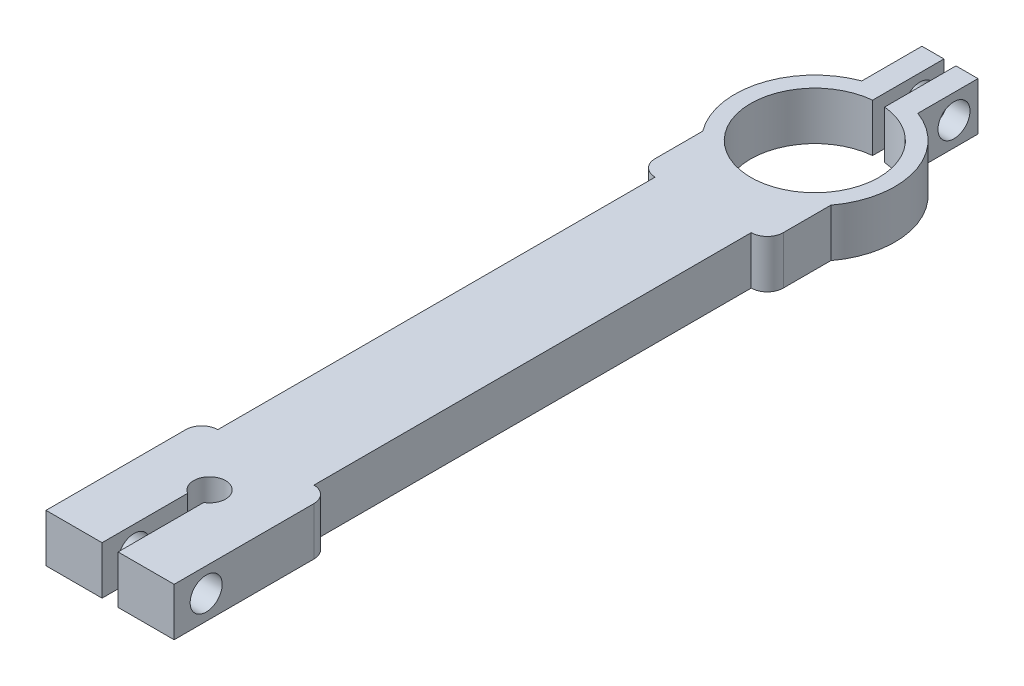
ISO-10303-21;
HEADER;
FILE_DESCRIPTION(('STEP AP214'),'2;1');
FILE_NAME('part.step','',(''),(''),'','','');
FILE_SCHEMA(('AUTOMOTIVE_DESIGN { 1 0 10303 214 1 1 1 1 }'));
ENDSEC;
DATA;
#1=APPLICATION_CONTEXT('core data for automotive mechanical design processes');
#2=APPLICATION_PROTOCOL_DEFINITION('international standard','automotive_design',2000,#1);
#3=PRODUCT_CONTEXT('',#1,'mechanical');
#4=PRODUCT('Part','Part','',(#3));
#5=PRODUCT_RELATED_PRODUCT_CATEGORY('part','',(#4));
#6=PRODUCT_DEFINITION_FORMATION('','',#4);
#7=PRODUCT_DEFINITION_CONTEXT('part definition',#1,'design');
#8=PRODUCT_DEFINITION('design','',#6,#7);
#9=PRODUCT_DEFINITION_SHAPE('','',#8);
#10=(LENGTH_UNIT() NAMED_UNIT(*) SI_UNIT(.MILLI.,.METRE.));
#11=(NAMED_UNIT(*) PLANE_ANGLE_UNIT() SI_UNIT($,.RADIAN.));
#12=(NAMED_UNIT(*) SI_UNIT($,.STERADIAN.) SOLID_ANGLE_UNIT());
#13=UNCERTAINTY_MEASURE_WITH_UNIT(LENGTH_MEASURE(1.E-05),#10,'distance_accuracy_value','');
#14=(GEOMETRIC_REPRESENTATION_CONTEXT(3) GLOBAL_UNCERTAINTY_ASSIGNED_CONTEXT((#13)) GLOBAL_UNIT_ASSIGNED_CONTEXT((#10,
#11,#12)) REPRESENTATION_CONTEXT('',''));
#15=CARTESIAN_POINT('',(0.,0.,0.));
#16=DIRECTION('',(0.,0.,1.));
#17=DIRECTION('',(1.,0.,0.));
#18=AXIS2_PLACEMENT_3D('',#15,#16,#17);
#19=CARTESIAN_POINT('',(0.,3.,0.));
#20=DIRECTION('',(0.,-1.,0.));
#21=DIRECTION('',(0.,0.,-1.));
#22=AXIS2_PLACEMENT_3D('',#19,#20,#21);
#23=PLANE('',#22);
#24=DIRECTION('',(0.,0.,1.));
#25=VECTOR('',#24,1.);
#26=CARTESIAN_POINT('',(3.,3.,0.));
#27=LINE('',#26,#25);
#28=CARTESIAN_POINT('',(3.,3.,-37.0293999803373));
#29=VERTEX_POINT('',#28);
#30=CARTESIAN_POINT('',(3.,3.,-9.72603449388032));
#31=VERTEX_POINT('',#30);
#32=EDGE_CURVE('E229',#29,#31,#27,.T.);
#33=ORIENTED_EDGE('',*,*,#32,.F.);
#34=CARTESIAN_POINT('',(3.,3.,-38.0293999803373));
#35=DIRECTION('',(0.,-1.,0.));
#36=DIRECTION('',(0.,0.,-1.));
#37=AXIS2_PLACEMENT_3D('',#34,#35,#36);
#38=CIRCLE('',#37,1.);
#39=CARTESIAN_POINT('',(4.,3.,-38.0293999803373));
#40=VERTEX_POINT('',#39);
#41=EDGE_CURVE('E453',#29,#40,#38,.F.);
#42=ORIENTED_EDGE('',*,*,#41,.T.);
#43=DIRECTION('',(0.,0.,-1.));
#44=VECTOR('',#43,1.);
#45=CARTESIAN_POINT('',(4.,3.,0.));
#46=LINE('',#45,#44);
#47=CARTESIAN_POINT('',(4.,3.,-41.));
#48=VERTEX_POINT('',#47);
#49=EDGE_CURVE('E405',#40,#48,#46,.T.);
#50=ORIENTED_EDGE('',*,*,#49,.T.);
#51=CARTESIAN_POINT('',(0.,3.,-44.));
#52=DIRECTION('',(0.,1.,0.));
#53=DIRECTION('',(0.,0.,1.));
#54=AXIS2_PLACEMENT_3D('',#51,#52,#53);
#55=CIRCLE('',#54,5.);
#56=CARTESIAN_POINT('',(1.75,3.,-48.6837484987988));
#57=VERTEX_POINT('',#56);
#58=EDGE_CURVE('E387',#48,#57,#55,.T.);
#59=ORIENTED_EDGE('',*,*,#58,.T.);
#60=DIRECTION('',(0.,0.,1.));
#61=VECTOR('',#60,1.);
#62=CARTESIAN_POINT('',(1.75,3.,-52.4372870221925));
#63=LINE('',#62,#61);
#64=CARTESIAN_POINT('',(1.75,3.,-52.4372870221925));
#65=VERTEX_POINT('',#64);
#66=EDGE_CURVE('E339',#65,#57,#63,.T.);
#67=ORIENTED_EDGE('',*,*,#66,.F.);
#68=DIRECTION('',(-1.,0.,0.));
#69=VECTOR('',#68,1.);
#70=CARTESIAN_POINT('',(1.75,3.,-52.4372870221925));
#71=LINE('',#70,#69);
#72=CARTESIAN_POINT('',(0.375,3.,-52.4372870221925));
#73=VERTEX_POINT('',#72);
#74=EDGE_CURVE('E330',#65,#73,#71,.T.);
#75=ORIENTED_EDGE('',*,*,#74,.T.);
#76=DIRECTION('',(0.,0.,-1.));
#77=VECTOR('',#76,1.);
#78=CARTESIAN_POINT('',(0.375,3.,0.));
#79=LINE('',#78,#77);
#80=CARTESIAN_POINT('',(0.375,3.,-47.9823830805185));
#81=VERTEX_POINT('',#80);
#82=EDGE_CURVE('E318',#81,#73,#79,.T.);
#83=ORIENTED_EDGE('',*,*,#82,.F.);
#84=CARTESIAN_POINT('',(0.,3.,-44.));
#85=DIRECTION('',(0.,1.,0.));
#86=DIRECTION('',(0.,0.,1.));
#87=AXIS2_PLACEMENT_3D('',#84,#85,#86);
#88=CIRCLE('',#87,4.);
#89=CARTESIAN_POINT('',(-0.375,3.,-47.9823830805185));
#90=VERTEX_POINT('',#89);
#91=EDGE_CURVE('E379',#90,#81,#88,.T.);
#92=ORIENTED_EDGE('',*,*,#91,.F.);
#93=DIRECTION('',(0.,0.,1.));
#94=VECTOR('',#93,1.);
#95=CARTESIAN_POINT('',(-0.375,3.,0.));
#96=LINE('',#95,#94);
#97=CARTESIAN_POINT('',(-0.375,3.,-52.4372870221925));
#98=VERTEX_POINT('',#97);
#99=EDGE_CURVE('E307',#98,#90,#96,.T.);
#100=ORIENTED_EDGE('',*,*,#99,.F.);
#101=CARTESIAN_POINT('',(-1.75,3.,-52.4372870221925));
#102=VERTEX_POINT('',#101);
#103=EDGE_CURVE('E335',#98,#102,#71,.T.);
#104=ORIENTED_EDGE('',*,*,#103,.T.);
#105=DIRECTION('',(0.,0.,1.));
#106=VECTOR('',#105,1.);
#107=CARTESIAN_POINT('',(-1.75,3.,-52.4372870221925));
#108=LINE('',#107,#106);
#109=CARTESIAN_POINT('',(-1.75,3.,-48.6837484987988));
#110=VERTEX_POINT('',#109);
#111=EDGE_CURVE('E334',#102,#110,#108,.T.);
#112=ORIENTED_EDGE('',*,*,#111,.T.);
#113=CARTESIAN_POINT('',(-4.,3.,-41.));
#114=VERTEX_POINT('',#113);
#115=EDGE_CURVE('E391',#110,#114,#55,.T.);
#116=ORIENTED_EDGE('',*,*,#115,.T.);
#117=DIRECTION('',(0.,0.,1.));
#118=VECTOR('',#117,1.);
#119=CARTESIAN_POINT('',(-4.,3.,0.));
#120=LINE('',#119,#118);
#121=CARTESIAN_POINT('',(-4.,3.,-38.0293999803373));
#122=VERTEX_POINT('',#121);
#123=EDGE_CURVE('E395',#114,#122,#120,.T.);
#124=ORIENTED_EDGE('',*,*,#123,.T.);
#125=CARTESIAN_POINT('',(-3.,3.,-38.0293999803373));
#126=DIRECTION('',(0.,-1.,0.));
#127=DIRECTION('',(0.,0.,-1.));
#128=AXIS2_PLACEMENT_3D('',#125,#126,#127);
#129=CIRCLE('',#128,1.);
#130=CARTESIAN_POINT('',(-3.,3.,-37.0293999803373));
#131=VERTEX_POINT('',#130);
#132=EDGE_CURVE('E450',#122,#131,#129,.F.);
#133=ORIENTED_EDGE('',*,*,#132,.T.);
#134=DIRECTION('',(0.,0.,-1.));
#135=VECTOR('',#134,1.);
#136=CARTESIAN_POINT('',(-3.,3.,0.));
#137=LINE('',#136,#135);
#138=CARTESIAN_POINT('',(-3.,3.,-9.72603449388032));
#139=VERTEX_POINT('',#138);
#140=EDGE_CURVE('E234',#139,#131,#137,.T.);
#141=ORIENTED_EDGE('',*,*,#140,.F.);
#142=CARTESIAN_POINT('',(-3.,3.,-8.72603449388032));
#143=DIRECTION('',(0.,-1.,0.));
#144=DIRECTION('',(0.,0.,-1.));
#145=AXIS2_PLACEMENT_3D('',#142,#143,#144);
#146=CIRCLE('',#145,1.);
#147=CARTESIAN_POINT('',(-4.,3.,-8.72603449388032));
#148=VERTEX_POINT('',#147);
#149=EDGE_CURVE('E227',#139,#148,#146,.F.);
#150=ORIENTED_EDGE('',*,*,#149,.T.);
#151=CARTESIAN_POINT('',(-4.,3.,0.));
#152=VERTEX_POINT('',#151);
#153=EDGE_CURVE('E400',#148,#152,#120,.T.);
#154=ORIENTED_EDGE('',*,*,#153,.T.);
#155=DIRECTION('',(1.,0.,0.));
#156=VECTOR('',#155,1.);
#157=CARTESIAN_POINT('',(-4.,3.,0.));
#158=LINE('',#157,#156);
#159=CARTESIAN_POINT('',(-0.5,3.,0.));
#160=VERTEX_POINT('',#159);
#161=EDGE_CURVE('E401',#152,#160,#158,.T.);
#162=ORIENTED_EDGE('',*,*,#161,.T.);
#163=DIRECTION('',(0.,0.,1.));
#164=VECTOR('',#163,1.);
#165=CARTESIAN_POINT('',(-0.5,3.,0.));
#166=LINE('',#165,#164);
#167=CARTESIAN_POINT('',(-0.5,3.,-5.34704948280375));
#168=VERTEX_POINT('',#167);
#169=EDGE_CURVE('E272',#168,#160,#166,.T.);
#170=ORIENTED_EDGE('',*,*,#169,.F.);
#171=CARTESIAN_POINT('',(0.,3.,-6.21307488658818));
#172=DIRECTION('',(0.,1.,0.));
#173=DIRECTION('',(0.,0.,1.));
#174=AXIS2_PLACEMENT_3D('',#171,#172,#173);
#175=CIRCLE('',#174,0.999999999999987);
#176=CARTESIAN_POINT('',(0.499999999999997,3.,-5.34704948280375));
#177=VERTEX_POINT('',#176);
#178=EDGE_CURVE('E279',#177,#168,#175,.T.);
#179=ORIENTED_EDGE('',*,*,#178,.F.);
#180=DIRECTION('',(0.,0.,-1.));
#181=VECTOR('',#180,1.);
#182=CARTESIAN_POINT('',(0.5,3.,0.));
#183=LINE('',#182,#181);
#184=CARTESIAN_POINT('',(0.5,3.,0.));
#185=VERTEX_POINT('',#184);
#186=EDGE_CURVE('E265',#185,#177,#183,.T.);
#187=ORIENTED_EDGE('',*,*,#186,.F.);
#188=CARTESIAN_POINT('',(4.,3.,0.));
#189=VERTEX_POINT('',#188);
#190=EDGE_CURVE('E399',#185,#189,#158,.T.);
#191=ORIENTED_EDGE('',*,*,#190,.T.);
#192=CARTESIAN_POINT('',(4.,3.,-8.72603449388032));
#193=VERTEX_POINT('',#192);
#194=EDGE_CURVE('E406',#189,#193,#46,.T.);
#195=ORIENTED_EDGE('',*,*,#194,.T.);
#196=CARTESIAN_POINT('',(3.,3.,-8.72603449388032));
#197=DIRECTION('',(0.,-1.,0.));
#198=DIRECTION('',(0.,0.,-1.));
#199=AXIS2_PLACEMENT_3D('',#196,#197,#198);
#200=CIRCLE('',#199,1.);
#201=EDGE_CURVE('E447',#193,#31,#200,.F.);
#202=ORIENTED_EDGE('',*,*,#201,.T.);
#203=EDGE_LOOP('',(#33,#42,#50,#59,#67,#75,#83,#92,#100,#104,#112,#116,#124,#133,#141,#150,#154,
#162,#170,#179,#187,#191,#195,#202));
#204=FACE_BOUND('',#203,.T.);
#205=ADVANCED_FACE('F41',(#204),#23,.F.);
#206=CARTESIAN_POINT('',(0.,0.,0.));
#207=DIRECTION('',(0.,-1.,0.));
#208=DIRECTION('',(0.,0.,-1.));
#209=AXIS2_PLACEMENT_3D('',#206,#207,#208);
#210=PLANE('',#209);
#211=DIRECTION('',(0.,0.,-1.));
#212=VECTOR('',#211,1.);
#213=CARTESIAN_POINT('',(4.,0.,0.));
#214=LINE('',#213,#212);
#215=CARTESIAN_POINT('',(4.,0.,-38.0293999803373));
#216=VERTEX_POINT('',#215);
#217=CARTESIAN_POINT('',(4.,0.,-41.));
#218=VERTEX_POINT('',#217);
#219=EDGE_CURVE('E419',#216,#218,#214,.T.);
#220=ORIENTED_EDGE('',*,*,#219,.F.);
#221=CARTESIAN_POINT('',(3.,0.,-38.0293999803373));
#222=DIRECTION('',(0.,-1.,0.));
#223=DIRECTION('',(0.,0.,-1.));
#224=AXIS2_PLACEMENT_3D('',#221,#222,#223);
#225=CIRCLE('',#224,1.);
#226=CARTESIAN_POINT('',(3.,0.,-37.0293999803373));
#227=VERTEX_POINT('',#226);
#228=EDGE_CURVE('E462',#216,#227,#225,.T.);
#229=ORIENTED_EDGE('',*,*,#228,.T.);
#230=DIRECTION('',(0.,0.,1.));
#231=VECTOR('',#230,1.);
#232=CARTESIAN_POINT('',(3.,0.,-9.72603449388032));
#233=LINE('',#232,#231);
#234=CARTESIAN_POINT('',(3.,0.,-9.72603449388032));
#235=VERTEX_POINT('',#234);
#236=EDGE_CURVE('E238',#227,#235,#233,.T.);
#237=ORIENTED_EDGE('',*,*,#236,.T.);
#238=CARTESIAN_POINT('',(3.,0.,-8.72603449388032));
#239=DIRECTION('',(0.,-1.,0.));
#240=DIRECTION('',(0.,0.,-1.));
#241=AXIS2_PLACEMENT_3D('',#238,#239,#240);
#242=CIRCLE('',#241,1.);
#243=CARTESIAN_POINT('',(4.,0.,-8.72603449388032));
#244=VERTEX_POINT('',#243);
#245=EDGE_CURVE('E57',#235,#244,#242,.T.);
#246=ORIENTED_EDGE('',*,*,#245,.T.);
#247=CARTESIAN_POINT('',(4.,0.,0.));
#248=VERTEX_POINT('',#247);
#249=EDGE_CURVE('E420',#248,#244,#214,.T.);
#250=ORIENTED_EDGE('',*,*,#249,.F.);
#251=DIRECTION('',(1.,0.,0.));
#252=VECTOR('',#251,1.);
#253=CARTESIAN_POINT('',(-4.,0.,0.));
#254=LINE('',#253,#252);
#255=CARTESIAN_POINT('',(0.5,0.,0.));
#256=VERTEX_POINT('',#255);
#257=EDGE_CURVE('E414',#256,#248,#254,.T.);
#258=ORIENTED_EDGE('',*,*,#257,.F.);
#259=DIRECTION('',(0.,0.,-1.));
#260=VECTOR('',#259,1.);
#261=CARTESIAN_POINT('',(0.5,0.,0.));
#262=LINE('',#261,#260);
#263=CARTESIAN_POINT('',(0.5,0.,-5.34704948280375));
#264=VERTEX_POINT('',#263);
#265=EDGE_CURVE('E254',#256,#264,#262,.T.);
#266=ORIENTED_EDGE('',*,*,#265,.T.);
#267=CARTESIAN_POINT('',(0.,0.,-6.21307488658818));
#268=DIRECTION('',(0.,1.,0.));
#269=DIRECTION('',(0.,0.,1.));
#270=AXIS2_PLACEMENT_3D('',#267,#268,#269);
#271=CIRCLE('',#270,0.999999999999999);
#272=CARTESIAN_POINT('',(-0.500000000000003,0.,-5.34704948280374));
#273=VERTEX_POINT('',#272);
#274=EDGE_CURVE('E283',#264,#273,#271,.T.);
#275=ORIENTED_EDGE('',*,*,#274,.T.);
#276=DIRECTION('',(0.,0.,1.));
#277=VECTOR('',#276,1.);
#278=CARTESIAN_POINT('',(-0.5,0.,0.));
#279=LINE('',#278,#277);
#280=CARTESIAN_POINT('',(-0.5,0.,0.));
#281=VERTEX_POINT('',#280);
#282=EDGE_CURVE('E250',#273,#281,#279,.T.);
#283=ORIENTED_EDGE('',*,*,#282,.T.);
#284=CARTESIAN_POINT('',(-4.,0.,0.));
#285=VERTEX_POINT('',#284);
#286=EDGE_CURVE('E415',#285,#281,#254,.T.);
#287=ORIENTED_EDGE('',*,*,#286,.F.);
#288=DIRECTION('',(0.,0.,1.));
#289=VECTOR('',#288,1.);
#290=CARTESIAN_POINT('',(-4.,0.,0.));
#291=LINE('',#290,#289);
#292=CARTESIAN_POINT('',(-4.,0.,-8.72603449388032));
#293=VERTEX_POINT('',#292);
#294=EDGE_CURVE('E208',#293,#285,#291,.T.);
#295=ORIENTED_EDGE('',*,*,#294,.F.);
#296=CARTESIAN_POINT('',(-3.,0.,-8.72603449388032));
#297=DIRECTION('',(0.,-1.,0.));
#298=DIRECTION('',(0.,0.,-1.));
#299=AXIS2_PLACEMENT_3D('',#296,#297,#298);
#300=CIRCLE('',#299,1.);
#301=CARTESIAN_POINT('',(-3.,0.,-9.72603449388032));
#302=VERTEX_POINT('',#301);
#303=EDGE_CURVE('E202',#293,#302,#300,.T.);
#304=ORIENTED_EDGE('',*,*,#303,.T.);
#305=DIRECTION('',(0.,0.,-1.));
#306=VECTOR('',#305,1.);
#307=CARTESIAN_POINT('',(-3.,0.,-9.72603449388032));
#308=LINE('',#307,#306);
#309=CARTESIAN_POINT('',(-3.,0.,-37.0293999803373));
#310=VERTEX_POINT('',#309);
#311=EDGE_CURVE('E206',#302,#310,#308,.T.);
#312=ORIENTED_EDGE('',*,*,#311,.T.);
#313=CARTESIAN_POINT('',(-3.,0.,-38.0293999803373));
#314=DIRECTION('',(0.,-1.,0.));
#315=DIRECTION('',(0.,0.,-1.));
#316=AXIS2_PLACEMENT_3D('',#313,#314,#315);
#317=CIRCLE('',#316,1.);
#318=CARTESIAN_POINT('',(-4.,0.,-38.0293999803373));
#319=VERTEX_POINT('',#318);
#320=EDGE_CURVE('E64',#310,#319,#317,.T.);
#321=ORIENTED_EDGE('',*,*,#320,.T.);
#322=CARTESIAN_POINT('',(-4.,0.,-41.));
#323=VERTEX_POINT('',#322);
#324=EDGE_CURVE('E411',#323,#319,#291,.T.);
#325=ORIENTED_EDGE('',*,*,#324,.F.);
#326=CARTESIAN_POINT('',(0.,0.,-44.));
#327=DIRECTION('',(0.,1.,0.));
#328=DIRECTION('',(0.,0.,1.));
#329=AXIS2_PLACEMENT_3D('',#326,#327,#328);
#330=CIRCLE('',#329,5.);
#331=CARTESIAN_POINT('',(-1.75,0.,-48.6837484987988));
#332=VERTEX_POINT('',#331);
#333=EDGE_CURVE('E383',#332,#323,#330,.T.);
#334=ORIENTED_EDGE('',*,*,#333,.F.);
#335=DIRECTION('',(0.,0.,1.));
#336=VECTOR('',#335,1.);
#337=CARTESIAN_POINT('',(-1.75,0.,-52.4372870221925));
#338=LINE('',#337,#336);
#339=CARTESIAN_POINT('',(-1.75,0.,-52.4372870221925));
#340=VERTEX_POINT('',#339);
#341=EDGE_CURVE('E348',#340,#332,#338,.T.);
#342=ORIENTED_EDGE('',*,*,#341,.F.);
#343=DIRECTION('',(-1.,0.,0.));
#344=VECTOR('',#343,1.);
#345=CARTESIAN_POINT('',(1.75,0.,-52.4372870221925));
#346=LINE('',#345,#344);
#347=CARTESIAN_POINT('',(-0.375,0.,-52.4372870221925));
#348=VERTEX_POINT('',#347);
#349=EDGE_CURVE('E349',#348,#340,#346,.T.);
#350=ORIENTED_EDGE('',*,*,#349,.F.);
#351=DIRECTION('',(0.,0.,1.));
#352=VECTOR('',#351,1.);
#353=CARTESIAN_POINT('',(-0.375,0.,-47.7386681594929));
#354=LINE('',#353,#352);
#355=CARTESIAN_POINT('',(-0.375,0.,-47.9823830805185));
#356=VERTEX_POINT('',#355);
#357=EDGE_CURVE('E299',#348,#356,#354,.T.);
#358=ORIENTED_EDGE('',*,*,#357,.T.);
#359=CARTESIAN_POINT('',(0.,0.,-44.));
#360=DIRECTION('',(0.,1.,0.));
#361=DIRECTION('',(0.,0.,1.));
#362=AXIS2_PLACEMENT_3D('',#359,#360,#361);
#363=CIRCLE('',#362,4.);
#364=CARTESIAN_POINT('',(0.375,0.,-47.9823830805185));
#365=VERTEX_POINT('',#364);
#366=EDGE_CURVE('E378',#356,#365,#363,.T.);
#367=ORIENTED_EDGE('',*,*,#366,.T.);
#368=DIRECTION('',(0.,0.,-1.));
#369=VECTOR('',#368,1.);
#370=CARTESIAN_POINT('',(0.375,0.,-47.7386681594929));
#371=LINE('',#370,#369);
#372=CARTESIAN_POINT('',(0.375,0.,-52.4372870221925));
#373=VERTEX_POINT('',#372);
#374=EDGE_CURVE('E295',#365,#373,#371,.T.);
#375=ORIENTED_EDGE('',*,*,#374,.T.);
#376=CARTESIAN_POINT('',(1.75,0.,-52.4372870221925));
#377=VERTEX_POINT('',#376);
#378=EDGE_CURVE('E344',#377,#373,#346,.T.);
#379=ORIENTED_EDGE('',*,*,#378,.F.);
#380=DIRECTION('',(0.,0.,1.));
#381=VECTOR('',#380,1.);
#382=CARTESIAN_POINT('',(1.75,0.,-52.4372870221925));
#383=LINE('',#382,#381);
#384=CARTESIAN_POINT('',(1.75,0.,-48.6837484987988));
#385=VERTEX_POINT('',#384);
#386=EDGE_CURVE('E353',#377,#385,#383,.T.);
#387=ORIENTED_EDGE('',*,*,#386,.T.);
#388=EDGE_CURVE('E392',#218,#385,#330,.T.);
#389=ORIENTED_EDGE('',*,*,#388,.F.);
#390=EDGE_LOOP('',(#220,#229,#237,#246,#250,#258,#266,#275,#283,#287,#295,#304,#312,#321,#325,
#334,#342,#350,#358,#367,#375,#379,#387,#389));
#391=FACE_BOUND('',#390,.T.);
#392=ADVANCED_FACE('F205',(#391),#210,.T.);
#393=CARTESIAN_POINT('',(-4.,3.,0.));
#394=DIRECTION('',(1.,0.,0.));
#395=DIRECTION('',(0.,0.,-1.));
#396=AXIS2_PLACEMENT_3D('',#393,#394,#395);
#397=PLANE('',#396);
#398=CARTESIAN_POINT('',(-4.,1.5,-2.));
#399=DIRECTION('',(1.,0.,0.));
#400=DIRECTION('',(0.,0.,-1.));
#401=AXIS2_PLACEMENT_3D('',#398,#399,#400);
#402=CIRCLE('',#401,0.999999999999992);
#403=CARTESIAN_POINT('',(-4.,1.5,-2.99999999999999));
#404=VERTEX_POINT('',#403);
#405=EDGE_CURVE('E291',#404,#404,#402,.T.);
#406=ORIENTED_EDGE('',*,*,#405,.T.);
#407=EDGE_LOOP('',(#406));
#408=FACE_BOUND('',#407,.T.);
#409=ORIENTED_EDGE('',*,*,#153,.F.);
#410=DIRECTION('',(0.,1.,0.));
#411=VECTOR('',#410,1.);
#412=CARTESIAN_POINT('',(-4.,0.,-8.72603449388032));
#413=LINE('',#412,#411);
#414=EDGE_CURVE('E11',#148,#293,#413,.F.);
#415=ORIENTED_EDGE('',*,*,#414,.T.);
#416=ORIENTED_EDGE('',*,*,#294,.T.);
#417=DIRECTION('',(0.,-1.,0.));
#418=VECTOR('',#417,1.);
#419=CARTESIAN_POINT('',(-4.,3.,0.));
#420=LINE('',#419,#418);
#421=EDGE_CURVE('E426',#152,#285,#420,.T.);
#422=ORIENTED_EDGE('',*,*,#421,.F.);
#423=EDGE_LOOP('',(#409,#415,#416,#422));
#424=FACE_BOUND('',#423,.T.);
#425=ADVANCED_FACE('F564',(#408,#424),#397,.F.);
#426=ORIENTED_EDGE('',*,*,#324,.T.);
#427=DIRECTION('',(0.,-1.,0.));
#428=VECTOR('',#427,1.);
#429=CARTESIAN_POINT('',(-4.,3.,-38.0293999803373));
#430=LINE('',#429,#428);
#431=EDGE_CURVE('E465',#319,#122,#430,.F.);
#432=ORIENTED_EDGE('',*,*,#431,.T.);
#433=ORIENTED_EDGE('',*,*,#123,.F.);
#434=DIRECTION('',(0.,-1.,0.));
#435=VECTOR('',#434,1.);
#436=CARTESIAN_POINT('',(-4.,3.,-41.));
#437=LINE('',#436,#435);
#438=EDGE_CURVE('E374',#323,#114,#437,.F.);
#439=ORIENTED_EDGE('',*,*,#438,.F.);
#440=EDGE_LOOP('',(#426,#432,#433,#439));
#441=FACE_BOUND('',#440,.T.);
#442=ADVANCED_FACE('F571',(#441),#397,.F.);
#443=CARTESIAN_POINT('',(4.,3.,0.));
#444=DIRECTION('',(-1.,0.,0.));
#445=DIRECTION('',(0.,0.,1.));
#446=AXIS2_PLACEMENT_3D('',#443,#444,#445);
#447=PLANE('',#446);
#448=ORIENTED_EDGE('',*,*,#49,.F.);
#449=DIRECTION('',(0.,1.,0.));
#450=VECTOR('',#449,1.);
#451=CARTESIAN_POINT('',(4.,0.,-38.0293999803373));
#452=LINE('',#451,#450);
#453=EDGE_CURVE('E213',#40,#216,#452,.F.);
#454=ORIENTED_EDGE('',*,*,#453,.T.);
#455=ORIENTED_EDGE('',*,*,#219,.T.);
#456=DIRECTION('',(0.,-1.,0.));
#457=VECTOR('',#456,1.);
#458=CARTESIAN_POINT('',(4.,3.,-41.));
#459=LINE('',#458,#457);
#460=EDGE_CURVE('E370',#48,#218,#459,.T.);
#461=ORIENTED_EDGE('',*,*,#460,.F.);
#462=EDGE_LOOP('',(#448,#454,#455,#461));
#463=FACE_BOUND('',#462,.T.);
#464=ADVANCED_FACE('F494',(#463),#447,.F.);
#465=CARTESIAN_POINT('',(4.,1.5,-2.));
#466=DIRECTION('',(1.,0.,0.));
#467=DIRECTION('',(0.,0.,-1.));
#468=AXIS2_PLACEMENT_3D('',#465,#466,#467);
#469=CIRCLE('',#468,0.999999999999987);
#470=CARTESIAN_POINT('',(4.,1.5,-2.99999999999999));
#471=VERTEX_POINT('',#470);
#472=EDGE_CURVE('E287',#471,#471,#469,.T.);
#473=ORIENTED_EDGE('',*,*,#472,.F.);
#474=EDGE_LOOP('',(#473));
#475=FACE_BOUND('',#474,.T.);
#476=ORIENTED_EDGE('',*,*,#249,.T.);
#477=DIRECTION('',(0.,-1.,0.));
#478=VECTOR('',#477,1.);
#479=CARTESIAN_POINT('',(4.,3.,-8.72603449388032));
#480=LINE('',#479,#478);
#481=EDGE_CURVE('E50',#244,#193,#480,.F.);
#482=ORIENTED_EDGE('',*,*,#481,.T.);
#483=ORIENTED_EDGE('',*,*,#194,.F.);
#484=DIRECTION('',(0.,-1.,0.));
#485=VECTOR('',#484,1.);
#486=CARTESIAN_POINT('',(4.,3.,0.));
#487=LINE('',#486,#485);
#488=EDGE_CURVE('E410',#189,#248,#487,.T.);
#489=ORIENTED_EDGE('',*,*,#488,.T.);
#490=EDGE_LOOP('',(#476,#482,#483,#489));
#491=FACE_BOUND('',#490,.T.);
#492=ADVANCED_FACE('F471',(#475,#491),#447,.F.);
#493=CARTESIAN_POINT('',(-4.,3.,0.));
#494=DIRECTION('',(0.,0.,-1.));
#495=DIRECTION('',(-1.,0.,0.));
#496=AXIS2_PLACEMENT_3D('',#493,#494,#495);
#497=PLANE('',#496);
#498=DIRECTION('',(0.,-1.,0.));
#499=VECTOR('',#498,1.);
#500=CARTESIAN_POINT('',(-0.5,5.,0.));
#501=LINE('',#500,#499);
#502=EDGE_CURVE('E262',#160,#281,#501,.T.);
#503=ORIENTED_EDGE('',*,*,#502,.F.);
#504=ORIENTED_EDGE('',*,*,#161,.F.);
#505=ORIENTED_EDGE('',*,*,#421,.T.);
#506=ORIENTED_EDGE('',*,*,#286,.T.);
#507=EDGE_LOOP('',(#503,#504,#505,#506));
#508=FACE_BOUND('',#507,.T.);
#509=ADVANCED_FACE('F572',(#508),#497,.F.);
#510=DIRECTION('',(0.,-1.,0.));
#511=VECTOR('',#510,1.);
#512=CARTESIAN_POINT('',(0.5,5.,0.));
#513=LINE('',#512,#511);
#514=EDGE_CURVE('E258',#185,#256,#513,.T.);
#515=ORIENTED_EDGE('',*,*,#514,.T.);
#516=ORIENTED_EDGE('',*,*,#257,.T.);
#517=ORIENTED_EDGE('',*,*,#488,.F.);
#518=ORIENTED_EDGE('',*,*,#190,.F.);
#519=EDGE_LOOP('',(#515,#516,#517,#518));
#520=FACE_BOUND('',#519,.T.);
#521=ADVANCED_FACE('F575',(#520),#497,.F.);
#522=CARTESIAN_POINT('',(4.,1.5,-2.));
#523=DIRECTION('',(1.,0.,0.));
#524=DIRECTION('',(0.,0.,-1.));
#525=AXIS2_PLACEMENT_3D('',#522,#523,#524);
#526=CYLINDRICAL_SURFACE('',#525,0.999999999999992);
#527=ORIENTED_EDGE('',*,*,#405,.F.);
#528=EDGE_LOOP('',(#527));
#529=FACE_BOUND('',#528,.T.);
#530=CARTESIAN_POINT('',(-0.5,1.5,-2.));
#531=DIRECTION('',(1.,0.,0.));
#532=DIRECTION('',(0.,0.,-1.));
#533=AXIS2_PLACEMENT_3D('',#530,#531,#532);
#534=CIRCLE('',#533,0.999999999999992);
#535=CARTESIAN_POINT('',(-0.5,1.5,-2.99999999999999));
#536=VERTEX_POINT('',#535);
#537=EDGE_CURVE('E275',#536,#536,#534,.F.);
#538=ORIENTED_EDGE('',*,*,#537,.F.);
#539=EDGE_LOOP('',(#538));
#540=FACE_BOUND('',#539,.T.);
#541=ADVANCED_FACE('F711',(#529,#540),#526,.F.);
#542=ORIENTED_EDGE('',*,*,#472,.T.);
#543=EDGE_LOOP('',(#542));
#544=FACE_BOUND('',#543,.T.);
#545=CARTESIAN_POINT('',(0.5,1.5,-2.));
#546=DIRECTION('',(-1.,0.,0.));
#547=DIRECTION('',(0.,0.,1.));
#548=AXIS2_PLACEMENT_3D('',#545,#546,#547);
#549=CIRCLE('',#548,0.999999999999992);
#550=CARTESIAN_POINT('',(0.5,1.5,-1.00000000000001));
#551=VERTEX_POINT('',#550);
#552=EDGE_CURVE('E268',#551,#551,#549,.F.);
#553=ORIENTED_EDGE('',*,*,#552,.F.);
#554=EDGE_LOOP('',(#553));
#555=FACE_BOUND('',#554,.T.);
#556=ADVANCED_FACE('F699',(#544,#555),#526,.F.);
#557=CARTESIAN_POINT('',(0.,3.,-6.21307488658818));
#558=DIRECTION('',(0.,1.,0.));
#559=DIRECTION('',(0.,0.,1.));
#560=AXIS2_PLACEMENT_3D('',#557,#558,#559);
#561=CYLINDRICAL_SURFACE('',#560,0.999999999999993);
#562=DIRECTION('',(0.,1.,0.));
#563=VECTOR('',#562,1.);
#564=CARTESIAN_POINT('',(-0.5,3.,-5.34704948280375));
#565=LINE('',#564,#563);
#566=EDGE_CURVE('E442',#273,#168,#565,.T.);
#567=ORIENTED_EDGE('',*,*,#566,.F.);
#568=ORIENTED_EDGE('',*,*,#274,.F.);
#569=DIRECTION('',(0.,1.,0.));
#570=VECTOR('',#569,1.);
#571=CARTESIAN_POINT('',(0.5,3.,-5.34704948280375));
#572=LINE('',#571,#570);
#573=EDGE_CURVE('E430',#177,#264,#572,.F.);
#574=ORIENTED_EDGE('',*,*,#573,.F.);
#575=ORIENTED_EDGE('',*,*,#178,.T.);
#576=EDGE_LOOP('',(#567,#568,#574,#575));
#577=FACE_BOUND('',#576,.T.);
#578=ADVANCED_FACE('F694',(#577),#561,.F.);
#579=CARTESIAN_POINT('',(0.,3.,-44.));
#580=DIRECTION('',(0.,-1.,0.));
#581=DIRECTION('',(0.,0.,-1.));
#582=AXIS2_PLACEMENT_3D('',#579,#580,#581);
#583=CYLINDRICAL_SURFACE('',#582,4.);
#584=ORIENTED_EDGE('',*,*,#91,.T.);
#585=DIRECTION('',(0.,-1.,0.));
#586=VECTOR('',#585,1.);
#587=CARTESIAN_POINT('',(0.375,3.,-47.9823830805185));
#588=LINE('',#587,#586);
#589=EDGE_CURVE('E321',#81,#365,#588,.T.);
#590=ORIENTED_EDGE('',*,*,#589,.T.);
#591=ORIENTED_EDGE('',*,*,#366,.F.);
#592=DIRECTION('',(0.,-1.,0.));
#593=VECTOR('',#592,1.);
#594=CARTESIAN_POINT('',(-0.375,3.,-47.9823830805185));
#595=LINE('',#594,#593);
#596=EDGE_CURVE('E310',#356,#90,#595,.F.);
#597=ORIENTED_EDGE('',*,*,#596,.T.);
#598=EDGE_LOOP('',(#584,#590,#591,#597));
#599=FACE_BOUND('',#598,.T.);
#600=ADVANCED_FACE('F525',(#599),#583,.F.);
#601=CARTESIAN_POINT('',(1.75,3.,-52.4372870221925));
#602=DIRECTION('',(0.,0.,1.));
#603=DIRECTION('',(1.,0.,0.));
#604=AXIS2_PLACEMENT_3D('',#601,#602,#603);
#605=PLANE('',#604);
#606=DIRECTION('',(0.,-1.,0.));
#607=VECTOR('',#606,1.);
#608=CARTESIAN_POINT('',(0.375,3.,-52.4372870221925));
#609=LINE('',#608,#607);
#610=EDGE_CURVE('E315',#73,#373,#609,.T.);
#611=ORIENTED_EDGE('',*,*,#610,.F.);
#612=ORIENTED_EDGE('',*,*,#74,.F.);
#613=DIRECTION('',(0.,-1.,0.));
#614=VECTOR('',#613,1.);
#615=CARTESIAN_POINT('',(1.75,3.,-52.4372870221925));
#616=LINE('',#615,#614);
#617=EDGE_CURVE('E343',#65,#377,#616,.T.);
#618=ORIENTED_EDGE('',*,*,#617,.T.);
#619=ORIENTED_EDGE('',*,*,#378,.T.);
#620=EDGE_LOOP('',(#611,#612,#618,#619));
#621=FACE_BOUND('',#620,.T.);
#622=ADVANCED_FACE('F531',(#621),#605,.F.);
#623=DIRECTION('',(0.,1.,0.));
#624=VECTOR('',#623,1.);
#625=CARTESIAN_POINT('',(-0.375,3.,-52.4372870221925));
#626=LINE('',#625,#624);
#627=EDGE_CURVE('E304',#348,#98,#626,.T.);
#628=ORIENTED_EDGE('',*,*,#627,.F.);
#629=ORIENTED_EDGE('',*,*,#349,.T.);
#630=DIRECTION('',(0.,-1.,0.));
#631=VECTOR('',#630,1.);
#632=CARTESIAN_POINT('',(-1.75,3.,-52.4372870221925));
#633=LINE('',#632,#631);
#634=EDGE_CURVE('E359',#102,#340,#633,.T.);
#635=ORIENTED_EDGE('',*,*,#634,.F.);
#636=ORIENTED_EDGE('',*,*,#103,.F.);
#637=EDGE_LOOP('',(#628,#629,#635,#636));
#638=FACE_BOUND('',#637,.T.);
#639=ADVANCED_FACE('F510',(#638),#605,.F.);
#640=CARTESIAN_POINT('',(-1.75,1.5,-50.9372870221925));
#641=DIRECTION('',(-1.,0.,0.));
#642=DIRECTION('',(0.,0.,1.));
#643=AXIS2_PLACEMENT_3D('',#640,#641,#642);
#644=CYLINDRICAL_SURFACE('',#643,0.999999999999999);
#645=CARTESIAN_POINT('',(1.75,1.5,-50.9372870221925));
#646=DIRECTION('',(1.,0.,0.));
#647=DIRECTION('',(0.,0.,-1.));
#648=AXIS2_PLACEMENT_3D('',#645,#646,#647);
#649=CIRCLE('',#648,0.999999999999999);
#650=CARTESIAN_POINT('',(1.75,1.5,-51.9372870221925));
#651=VERTEX_POINT('',#650);
#652=EDGE_CURVE('E329',#651,#651,#649,.T.);
#653=ORIENTED_EDGE('',*,*,#652,.T.);
#654=EDGE_LOOP('',(#653));
#655=FACE_BOUND('',#654,.T.);
#656=CARTESIAN_POINT('',(0.375,1.5,-50.9372870221925));
#657=DIRECTION('',(-1.,0.,0.));
#658=DIRECTION('',(0.,0.,1.));
#659=AXIS2_PLACEMENT_3D('',#656,#657,#658);
#660=CIRCLE('',#659,0.999999999999999);
#661=CARTESIAN_POINT('',(0.375,1.5,-49.9372870221925));
#662=VERTEX_POINT('',#661);
#663=EDGE_CURVE('E314',#662,#662,#660,.F.);
#664=ORIENTED_EDGE('',*,*,#663,.F.);
#665=EDGE_LOOP('',(#664));
#666=FACE_BOUND('',#665,.T.);
#667=ADVANCED_FACE('F546',(#655,#666),#644,.F.);
#668=CARTESIAN_POINT('',(-1.75,1.5,-50.9372870221925));
#669=DIRECTION('',(-1.,0.,0.));
#670=DIRECTION('',(0.,0.,1.));
#671=AXIS2_PLACEMENT_3D('',#668,#669,#670);
#672=CIRCLE('',#671,0.999999999999999);
#673=CARTESIAN_POINT('',(-1.75,1.5,-49.9372870221925));
#674=VERTEX_POINT('',#673);
#675=EDGE_CURVE('E325',#674,#674,#672,.T.);
#676=ORIENTED_EDGE('',*,*,#675,.T.);
#677=EDGE_LOOP('',(#676));
#678=FACE_BOUND('',#677,.T.);
#679=CARTESIAN_POINT('',(-0.375,1.5,-50.9372870221925));
#680=DIRECTION('',(1.,0.,0.));
#681=DIRECTION('',(0.,0.,-1.));
#682=AXIS2_PLACEMENT_3D('',#679,#680,#681);
#683=CIRCLE('',#682,0.999999999999999);
#684=CARTESIAN_POINT('',(-0.375,1.5,-51.9372870221925));
#685=VERTEX_POINT('',#684);
#686=EDGE_CURVE('E303',#685,#685,#683,.F.);
#687=ORIENTED_EDGE('',*,*,#686,.F.);
#688=EDGE_LOOP('',(#687));
#689=FACE_BOUND('',#688,.T.);
#690=ADVANCED_FACE('F548',(#678,#689),#644,.F.);
#691=CARTESIAN_POINT('',(0.,3.,-44.));
#692=DIRECTION('',(0.,-1.,0.));
#693=DIRECTION('',(0.,0.,-1.));
#694=AXIS2_PLACEMENT_3D('',#691,#692,#693);
#695=CYLINDRICAL_SURFACE('',#694,5.);
#696=DIRECTION('',(0.,-1.,0.));
#697=VECTOR('',#696,1.);
#698=CARTESIAN_POINT('',(-1.75,3.,-48.6837484987988));
#699=LINE('',#698,#697);
#700=EDGE_CURVE('E366',#332,#110,#699,.F.);
#701=ORIENTED_EDGE('',*,*,#700,.F.);
#702=ORIENTED_EDGE('',*,*,#333,.T.);
#703=ORIENTED_EDGE('',*,*,#438,.T.);
#704=ORIENTED_EDGE('',*,*,#115,.F.);
#705=EDGE_LOOP('',(#701,#702,#703,#704));
#706=FACE_BOUND('',#705,.T.);
#707=ADVANCED_FACE('F555',(#706),#695,.T.);
#708=ORIENTED_EDGE('',*,*,#388,.T.);
#709=DIRECTION('',(0.,-1.,0.));
#710=VECTOR('',#709,1.);
#711=CARTESIAN_POINT('',(1.75,3.,-48.6837484987988));
#712=LINE('',#711,#710);
#713=EDGE_CURVE('E363',#385,#57,#712,.F.);
#714=ORIENTED_EDGE('',*,*,#713,.T.);
#715=ORIENTED_EDGE('',*,*,#58,.F.);
#716=ORIENTED_EDGE('',*,*,#460,.T.);
#717=EDGE_LOOP('',(#708,#714,#715,#716));
#718=FACE_BOUND('',#717,.T.);
#719=ADVANCED_FACE('F538',(#718),#695,.T.);
#720=CARTESIAN_POINT('',(-1.75,3.,-52.4372870221925));
#721=DIRECTION('',(1.,0.,0.));
#722=DIRECTION('',(0.,0.,-1.));
#723=AXIS2_PLACEMENT_3D('',#720,#721,#722);
#724=PLANE('',#723);
#725=ORIENTED_EDGE('',*,*,#675,.F.);
#726=EDGE_LOOP('',(#725));
#727=FACE_BOUND('',#726,.T.);
#728=ORIENTED_EDGE('',*,*,#341,.T.);
#729=ORIENTED_EDGE('',*,*,#700,.T.);
#730=ORIENTED_EDGE('',*,*,#111,.F.);
#731=ORIENTED_EDGE('',*,*,#634,.T.);
#732=EDGE_LOOP('',(#728,#729,#730,#731));
#733=FACE_BOUND('',#732,.T.);
#734=ADVANCED_FACE('F515',(#727,#733),#724,.F.);
#735=CARTESIAN_POINT('',(1.75,3.,-52.4372870221925));
#736=DIRECTION('',(1.,0.,0.));
#737=DIRECTION('',(0.,0.,-1.));
#738=AXIS2_PLACEMENT_3D('',#735,#736,#737);
#739=PLANE('',#738);
#740=ORIENTED_EDGE('',*,*,#652,.F.);
#741=EDGE_LOOP('',(#740));
#742=FACE_BOUND('',#741,.T.);
#743=ORIENTED_EDGE('',*,*,#713,.F.);
#744=ORIENTED_EDGE('',*,*,#386,.F.);
#745=ORIENTED_EDGE('',*,*,#617,.F.);
#746=ORIENTED_EDGE('',*,*,#66,.T.);
#747=EDGE_LOOP('',(#743,#744,#745,#746));
#748=FACE_BOUND('',#747,.T.);
#749=ADVANCED_FACE('F536',(#742,#748),#739,.T.);
#750=CARTESIAN_POINT('',(-0.375,5.,-47.7386681594929));
#751=DIRECTION('',(1.,0.,0.));
#752=DIRECTION('',(0.,0.,-1.));
#753=AXIS2_PLACEMENT_3D('',#750,#751,#752);
#754=PLANE('',#753);
#755=ORIENTED_EDGE('',*,*,#357,.F.);
#756=ORIENTED_EDGE('',*,*,#627,.T.);
#757=ORIENTED_EDGE('',*,*,#99,.T.);
#758=ORIENTED_EDGE('',*,*,#596,.F.);
#759=EDGE_LOOP('',(#755,#756,#757,#758));
#760=FACE_BOUND('',#759,.T.);
#761=ORIENTED_EDGE('',*,*,#686,.T.);
#762=EDGE_LOOP('',(#761));
#763=FACE_BOUND('',#762,.T.);
#764=ADVANCED_FACE('F521',(#760,#763),#754,.T.);
#765=CARTESIAN_POINT('',(0.375,5.,-47.7386681594929));
#766=DIRECTION('',(-1.,0.,0.));
#767=DIRECTION('',(0.,0.,1.));
#768=AXIS2_PLACEMENT_3D('',#765,#766,#767);
#769=PLANE('',#768);
#770=ORIENTED_EDGE('',*,*,#82,.T.);
#771=ORIENTED_EDGE('',*,*,#610,.T.);
#772=ORIENTED_EDGE('',*,*,#374,.F.);
#773=ORIENTED_EDGE('',*,*,#589,.F.);
#774=EDGE_LOOP('',(#770,#771,#772,#773));
#775=FACE_BOUND('',#774,.T.);
#776=ORIENTED_EDGE('',*,*,#663,.T.);
#777=EDGE_LOOP('',(#776));
#778=FACE_BOUND('',#777,.T.);
#779=ADVANCED_FACE('F539',(#775,#778),#769,.T.);
#780=CARTESIAN_POINT('',(0.5,5.,0.));
#781=DIRECTION('',(-1.,0.,0.));
#782=DIRECTION('',(0.,0.,1.));
#783=AXIS2_PLACEMENT_3D('',#780,#781,#782);
#784=PLANE('',#783);
#785=ORIENTED_EDGE('',*,*,#186,.T.);
#786=ORIENTED_EDGE('',*,*,#573,.T.);
#787=ORIENTED_EDGE('',*,*,#265,.F.);
#788=ORIENTED_EDGE('',*,*,#514,.F.);
#789=EDGE_LOOP('',(#785,#786,#787,#788));
#790=FACE_BOUND('',#789,.T.);
#791=ORIENTED_EDGE('',*,*,#552,.T.);
#792=EDGE_LOOP('',(#791));
#793=FACE_BOUND('',#792,.T.);
#794=ADVANCED_FACE('F542',(#790,#793),#784,.T.);
#795=CARTESIAN_POINT('',(-0.5,5.,0.));
#796=DIRECTION('',(1.,0.,0.));
#797=DIRECTION('',(0.,0.,-1.));
#798=AXIS2_PLACEMENT_3D('',#795,#796,#797);
#799=PLANE('',#798);
#800=ORIENTED_EDGE('',*,*,#169,.T.);
#801=ORIENTED_EDGE('',*,*,#502,.T.);
#802=ORIENTED_EDGE('',*,*,#282,.F.);
#803=ORIENTED_EDGE('',*,*,#566,.T.);
#804=EDGE_LOOP('',(#800,#801,#802,#803));
#805=FACE_BOUND('',#804,.T.);
#806=ORIENTED_EDGE('',*,*,#537,.T.);
#807=EDGE_LOOP('',(#806));
#808=FACE_BOUND('',#807,.T.);
#809=ADVANCED_FACE('F624',(#805,#808),#799,.T.);
#810=CARTESIAN_POINT('',(3.,8.,-9.72603449388032));
#811=DIRECTION('',(1.,0.,0.));
#812=DIRECTION('',(0.,0.,-1.));
#813=AXIS2_PLACEMENT_3D('',#810,#811,#812);
#814=PLANE('',#813);
#815=ORIENTED_EDGE('',*,*,#32,.T.);
#816=DIRECTION('',(0.,-1.,0.));
#817=VECTOR('',#816,1.);
#818=CARTESIAN_POINT('',(3.,8.,-9.72603449388032));
#819=LINE('',#818,#817);
#820=EDGE_CURVE('E241',#31,#235,#819,.T.);
#821=ORIENTED_EDGE('',*,*,#820,.T.);
#822=ORIENTED_EDGE('',*,*,#236,.F.);
#823=DIRECTION('',(0.,-1.,0.));
#824=VECTOR('',#823,1.);
#825=CARTESIAN_POINT('',(3.,8.,-37.0293999803373));
#826=LINE('',#825,#824);
#827=EDGE_CURVE('E225',#29,#227,#826,.T.);
#828=ORIENTED_EDGE('',*,*,#827,.F.);
#829=EDGE_LOOP('',(#815,#821,#822,#828));
#830=FACE_BOUND('',#829,.T.);
#831=ADVANCED_FACE('F483',(#830),#814,.T.);
#832=CARTESIAN_POINT('',(-3.,8.,-9.72603449388032));
#833=DIRECTION('',(-1.,0.,0.));
#834=DIRECTION('',(0.,0.,1.));
#835=AXIS2_PLACEMENT_3D('',#832,#833,#834);
#836=PLANE('',#835);
#837=ORIENTED_EDGE('',*,*,#140,.T.);
#838=DIRECTION('',(0.,-1.,0.));
#839=VECTOR('',#838,1.);
#840=CARTESIAN_POINT('',(-3.,8.,-37.0293999803373));
#841=LINE('',#840,#839);
#842=EDGE_CURVE('E223',#131,#310,#841,.T.);
#843=ORIENTED_EDGE('',*,*,#842,.T.);
#844=ORIENTED_EDGE('',*,*,#311,.F.);
#845=DIRECTION('',(0.,-1.,0.));
#846=VECTOR('',#845,1.);
#847=CARTESIAN_POINT('',(-3.,8.,-9.72603449388032));
#848=LINE('',#847,#846);
#849=EDGE_CURVE('E220',#139,#302,#848,.T.);
#850=ORIENTED_EDGE('',*,*,#849,.F.);
#851=EDGE_LOOP('',(#837,#843,#844,#850));
#852=FACE_BOUND('',#851,.T.);
#853=ADVANCED_FACE('F219',(#852),#836,.T.);
#854=CARTESIAN_POINT('',(3.,8.,-38.0293999803373));
#855=DIRECTION('',(0.,-1.,0.));
#856=DIRECTION('',(0.,0.,-1.));
#857=AXIS2_PLACEMENT_3D('',#854,#855,#856);
#858=CYLINDRICAL_SURFACE('',#857,1.);
#859=ORIENTED_EDGE('',*,*,#228,.F.);
#860=ORIENTED_EDGE('',*,*,#453,.F.);
#861=ORIENTED_EDGE('',*,*,#41,.F.);
#862=ORIENTED_EDGE('',*,*,#827,.T.);
#863=EDGE_LOOP('',(#859,#860,#861,#862));
#864=FACE_BOUND('',#863,.T.);
#865=ADVANCED_FACE('F489',(#864),#858,.T.);
#866=CARTESIAN_POINT('',(-3.,8.,-38.0293999803373));
#867=DIRECTION('',(0.,1.,0.));
#868=DIRECTION('',(0.,0.,1.));
#869=AXIS2_PLACEMENT_3D('',#866,#867,#868);
#870=CYLINDRICAL_SURFACE('',#869,1.);
#871=ORIENTED_EDGE('',*,*,#132,.F.);
#872=ORIENTED_EDGE('',*,*,#431,.F.);
#873=ORIENTED_EDGE('',*,*,#320,.F.);
#874=ORIENTED_EDGE('',*,*,#842,.F.);
#875=EDGE_LOOP('',(#871,#872,#873,#874));
#876=FACE_BOUND('',#875,.T.);
#877=ADVANCED_FACE('F582',(#876),#870,.T.);
#878=CARTESIAN_POINT('',(3.,8.,-8.72603449388032));
#879=DIRECTION('',(0.,1.,0.));
#880=DIRECTION('',(0.,0.,1.));
#881=AXIS2_PLACEMENT_3D('',#878,#879,#880);
#882=CYLINDRICAL_SURFACE('',#881,1.);
#883=ORIENTED_EDGE('',*,*,#201,.F.);
#884=ORIENTED_EDGE('',*,*,#481,.F.);
#885=ORIENTED_EDGE('',*,*,#245,.F.);
#886=ORIENTED_EDGE('',*,*,#820,.F.);
#887=EDGE_LOOP('',(#883,#884,#885,#886));
#888=FACE_BOUND('',#887,.T.);
#889=ADVANCED_FACE('F480',(#888),#882,.T.);
#890=CARTESIAN_POINT('',(-3.,8.,-8.72603449388032));
#891=DIRECTION('',(0.,-1.,0.));
#892=DIRECTION('',(0.,0.,-1.));
#893=AXIS2_PLACEMENT_3D('',#890,#891,#892);
#894=CYLINDRICAL_SURFACE('',#893,1.);
#895=ORIENTED_EDGE('',*,*,#303,.F.);
#896=ORIENTED_EDGE('',*,*,#414,.F.);
#897=ORIENTED_EDGE('',*,*,#149,.F.);
#898=ORIENTED_EDGE('',*,*,#849,.T.);
#899=EDGE_LOOP('',(#895,#896,#897,#898));
#900=FACE_BOUND('',#899,.T.);
#901=ADVANCED_FACE('F43',(#900),#894,.T.);
#902=CLOSED_SHELL('',(#205,#392,#425,#442,#464,#492,#509,#521,#541,#556,#578,#600,#622,#639,
#667,#690,#707,#719,#734,#749,#764,#779,#794,#809,#831,#853,#865,#877,#889,#901));
#903=MANIFOLD_SOLID_BREP('B2',#902);
#904=ADVANCED_BREP_SHAPE_REPRESENTATION('',(#18,#903),#14);
#905=SHAPE_DEFINITION_REPRESENTATION(#9,#904);
ENDSEC;
END-ISO-10303-21;
